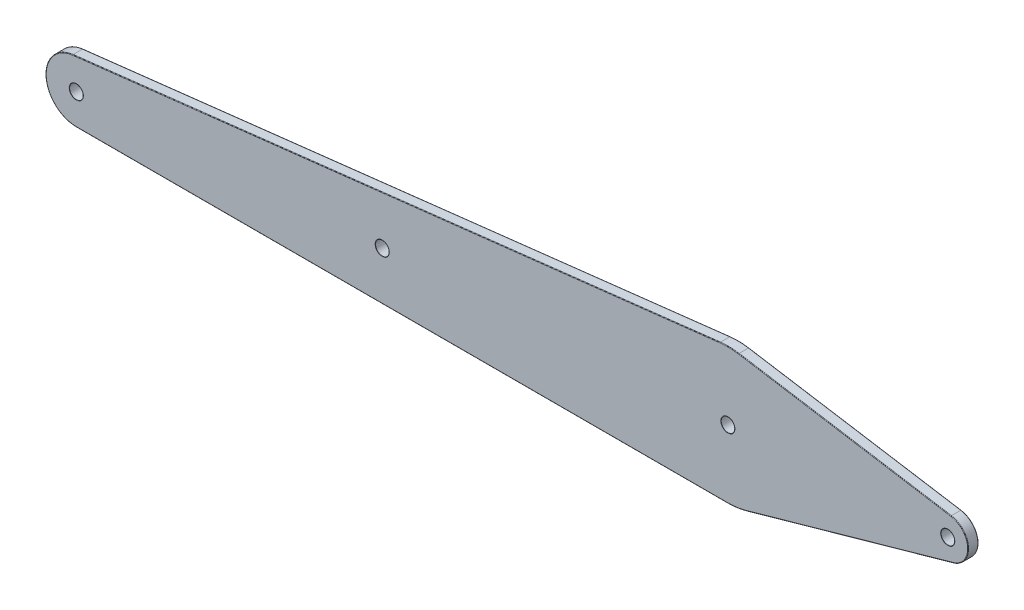
ISO-10303-21;
HEADER;
FILE_DESCRIPTION(('STEP AP214'),'2;1');
FILE_NAME('part.step','',(''),(''),'','','');
FILE_SCHEMA(('AUTOMOTIVE_DESIGN { 1 0 10303 214 1 1 1 1 }'));
ENDSEC;
DATA;
#1=APPLICATION_CONTEXT('core data for automotive mechanical design processes');
#2=APPLICATION_PROTOCOL_DEFINITION('international standard','automotive_design',2000,#1);
#3=PRODUCT_CONTEXT('',#1,'mechanical');
#4=PRODUCT('Part','Part','',(#3));
#5=PRODUCT_RELATED_PRODUCT_CATEGORY('part','',(#4));
#6=PRODUCT_DEFINITION_FORMATION('','',#4);
#7=PRODUCT_DEFINITION_CONTEXT('part definition',#1,'design');
#8=PRODUCT_DEFINITION('design','',#6,#7);
#9=PRODUCT_DEFINITION_SHAPE('','',#8);
#10=(LENGTH_UNIT() NAMED_UNIT(*) SI_UNIT(.MILLI.,.METRE.));
#11=(NAMED_UNIT(*) PLANE_ANGLE_UNIT() SI_UNIT($,.RADIAN.));
#12=(NAMED_UNIT(*) SI_UNIT($,.STERADIAN.) SOLID_ANGLE_UNIT());
#13=UNCERTAINTY_MEASURE_WITH_UNIT(LENGTH_MEASURE(1.E-05),#10,'distance_accuracy_value','');
#14=(GEOMETRIC_REPRESENTATION_CONTEXT(3) GLOBAL_UNCERTAINTY_ASSIGNED_CONTEXT((#13)) GLOBAL_UNIT_ASSIGNED_CONTEXT((#10,
#11,#12)) REPRESENTATION_CONTEXT('',''));
#15=CARTESIAN_POINT('',(0.,0.,0.));
#16=DIRECTION('',(0.,0.,1.));
#17=DIRECTION('',(1.,0.,0.));
#18=AXIS2_PLACEMENT_3D('',#15,#16,#17);
#19=CARTESIAN_POINT('',(-20.4156966855308,205.579870617494,-3.));
#20=DIRECTION('',(0.,0.,1.));
#21=DIRECTION('',(1.,0.,0.));
#22=AXIS2_PLACEMENT_3D('',#19,#20,#21);
#23=CYLINDRICAL_SURFACE('',#22,19.9999999999999);
#24=DIRECTION('',(0.,0.,1.));
#25=VECTOR('',#24,1.);
#26=CARTESIAN_POINT('',(-14.9830347816257,186.331852936759,-3.));
#27=LINE('',#26,#25);
#28=CARTESIAN_POINT('',(-14.9830347816257,186.331852936759,-2.85));
#29=VERTEX_POINT('',#28);
#30=CARTESIAN_POINT('',(-14.9830347816257,186.331852936759,-0.15));
#31=VERTEX_POINT('',#30);
#32=EDGE_CURVE('E253',#29,#31,#27,.T.);
#33=ORIENTED_EDGE('',*,*,#32,.T.);
#34=CARTESIAN_POINT('',(-20.4156966855308,205.579870617494,-0.15));
#35=DIRECTION('',(0.,0.,1.));
#36=DIRECTION('',(1.,0.,0.));
#37=AXIS2_PLACEMENT_3D('',#34,#35,#36);
#38=CIRCLE('',#37,19.9999999999999);
#39=CARTESIAN_POINT('',(-20.4156966855308,185.579870617494,-0.15));
#40=VERTEX_POINT('',#39);
#41=EDGE_CURVE('E210',#31,#40,#38,.F.);
#42=ORIENTED_EDGE('',*,*,#41,.T.);
#43=DIRECTION('',(0.,0.,1.));
#44=VECTOR('',#43,1.);
#45=CARTESIAN_POINT('',(-20.4156966855308,185.579870617494,-3.));
#46=LINE('',#45,#44);
#47=CARTESIAN_POINT('',(-20.4156966855308,185.579870617494,-2.85));
#48=VERTEX_POINT('',#47);
#49=EDGE_CURVE('E300',#48,#40,#46,.T.);
#50=ORIENTED_EDGE('',*,*,#49,.F.);
#51=CARTESIAN_POINT('',(-20.4156966855308,205.579870617494,-2.85));
#52=DIRECTION('',(0.,0.,1.));
#53=DIRECTION('',(1.,0.,0.));
#54=AXIS2_PLACEMENT_3D('',#51,#52,#53);
#55=CIRCLE('',#54,19.9999999999999);
#56=EDGE_CURVE('E208',#48,#29,#55,.T.);
#57=ORIENTED_EDGE('',*,*,#56,.T.);
#58=EDGE_LOOP('',(#33,#42,#50,#57));
#59=FACE_BOUND('',#58,.T.);
#60=ADVANCED_FACE('F34',(#59),#23,.T.);
#61=CARTESIAN_POINT('',(-212.100333524272,185.579870617494,-3.));
#62=DIRECTION('',(0.,-1.,0.));
#63=DIRECTION('',(1.,0.,0.));
#64=AXIS2_PLACEMENT_3D('',#61,#62,#63);
#65=PLANE('',#64);
#66=ORIENTED_EDGE('',*,*,#49,.T.);
#67=DIRECTION('',(1.,0.,0.));
#68=VECTOR('',#67,1.);
#69=CARTESIAN_POINT('',(-212.100333524272,185.579870617494,-0.15));
#70=LINE('',#69,#68);
#71=CARTESIAN_POINT('',(-212.100333524272,185.579870617494,-0.15));
#72=VERTEX_POINT('',#71);
#73=EDGE_CURVE('E154',#40,#72,#70,.F.);
#74=ORIENTED_EDGE('',*,*,#73,.T.);
#75=DIRECTION('',(0.,0.,1.));
#76=VECTOR('',#75,1.);
#77=CARTESIAN_POINT('',(-212.100333524272,185.579870617494,-3.));
#78=LINE('',#77,#76);
#79=CARTESIAN_POINT('',(-212.100333524272,185.579870617494,-2.85));
#80=VERTEX_POINT('',#79);
#81=EDGE_CURVE('E304',#80,#72,#78,.T.);
#82=ORIENTED_EDGE('',*,*,#81,.F.);
#83=DIRECTION('',(1.,0.,0.));
#84=VECTOR('',#83,1.);
#85=CARTESIAN_POINT('',(-20.4156966855308,185.579870617494,-2.85));
#86=LINE('',#85,#84);
#87=EDGE_CURVE('E175',#80,#48,#86,.T.);
#88=ORIENTED_EDGE('',*,*,#87,.T.);
#89=EDGE_LOOP('',(#66,#74,#82,#88));
#90=FACE_BOUND('',#89,.T.);
#91=ADVANCED_FACE('F354',(#90),#65,.T.);
#92=CARTESIAN_POINT('',(-212.100333524272,194.579870617494,-3.));
#93=DIRECTION('',(0.,0.,1.));
#94=DIRECTION('',(1.,0.,0.));
#95=AXIS2_PLACEMENT_3D('',#92,#93,#94);
#96=CYLINDRICAL_SURFACE('',#95,8.99999999999999);
#97=ORIENTED_EDGE('',*,*,#81,.T.);
#98=CARTESIAN_POINT('',(-212.100333524272,194.579870617494,-0.15));
#99=DIRECTION('',(0.,0.,1.));
#100=DIRECTION('',(1.,0.,0.));
#101=AXIS2_PLACEMENT_3D('',#98,#99,#100);
#102=CIRCLE('',#101,8.99999999999999);
#103=CARTESIAN_POINT('',(-213.129889679167,203.520788586244,-0.15));
#104=VERTEX_POINT('',#103);
#105=EDGE_CURVE('E185',#72,#104,#102,.F.);
#106=ORIENTED_EDGE('',*,*,#105,.T.);
#107=DIRECTION('',(0.,0.,1.));
#108=VECTOR('',#107,1.);
#109=CARTESIAN_POINT('',(-213.129889679167,203.520788586244,-3.));
#110=LINE('',#109,#108);
#111=CARTESIAN_POINT('',(-213.129889679167,203.520788586244,-2.85));
#112=VERTEX_POINT('',#111);
#113=EDGE_CURVE('E307',#112,#104,#110,.T.);
#114=ORIENTED_EDGE('',*,*,#113,.F.);
#115=CARTESIAN_POINT('',(-212.100333524272,194.579870617494,-2.85));
#116=DIRECTION('',(0.,0.,1.));
#117=DIRECTION('',(1.,0.,0.));
#118=AXIS2_PLACEMENT_3D('',#115,#116,#117);
#119=CIRCLE('',#118,8.99999999999999);
#120=EDGE_CURVE('E183',#112,#80,#119,.T.);
#121=ORIENTED_EDGE('',*,*,#120,.T.);
#122=EDGE_LOOP('',(#97,#106,#114,#121));
#123=FACE_BOUND('',#122,.T.);
#124=ADVANCED_FACE('F357',(#123),#96,.T.);
#125=CARTESIAN_POINT('',(-213.129889679167,203.520788586244,-3.));
#126=DIRECTION('',(-0.114395128321731,0.993435329861111,0.));
#127=DIRECTION('',(-0.993435329861111,-0.114395128321731,0.));
#128=AXIS2_PLACEMENT_3D('',#125,#126,#127);
#129=PLANE('',#128);
#130=ORIENTED_EDGE('',*,*,#113,.T.);
#131=DIRECTION('',(-0.993435329861111,-0.114395128321731,0.));
#132=VECTOR('',#131,1.);
#133=CARTESIAN_POINT('',(-213.129889679167,203.520788586244,-0.15));
#134=LINE('',#133,#132);
#135=CARTESIAN_POINT('',(-22.7035992519654,225.448577214716,-0.15));
#136=VERTEX_POINT('',#135);
#137=EDGE_CURVE('E189',#104,#136,#134,.F.);
#138=ORIENTED_EDGE('',*,*,#137,.T.);
#139=DIRECTION('',(0.,0.,1.));
#140=VECTOR('',#139,1.);
#141=CARTESIAN_POINT('',(-22.7035992519654,225.448577214716,-3.));
#142=LINE('',#141,#140);
#143=CARTESIAN_POINT('',(-22.7035992519654,225.448577214716,-2.85));
#144=VERTEX_POINT('',#143);
#145=EDGE_CURVE('E310',#144,#136,#142,.T.);
#146=ORIENTED_EDGE('',*,*,#145,.F.);
#147=DIRECTION('',(-0.993435329861111,-0.114395128321731,0.));
#148=VECTOR('',#147,1.);
#149=CARTESIAN_POINT('',(-213.129889679167,203.520788586244,-2.85));
#150=LINE('',#149,#148);
#151=EDGE_CURVE('E187',#144,#112,#150,.T.);
#152=ORIENTED_EDGE('',*,*,#151,.T.);
#153=EDGE_LOOP('',(#130,#138,#146,#152));
#154=FACE_BOUND('',#153,.T.);
#155=ADVANCED_FACE('F511',(#154),#129,.T.);
#156=CARTESIAN_POINT('',(-20.4156966855308,205.579870617494,-3.));
#157=DIRECTION('',(0.,0.,1.));
#158=DIRECTION('',(1.,0.,0.));
#159=AXIS2_PLACEMENT_3D('',#156,#157,#158);
#160=CYLINDRICAL_SURFACE('',#159,20.);
#161=ORIENTED_EDGE('',*,*,#145,.T.);
#162=CARTESIAN_POINT('',(-20.4156966855308,205.579870617494,-0.15));
#163=DIRECTION('',(0.,0.,1.));
#164=DIRECTION('',(1.,0.,0.));
#165=AXIS2_PLACEMENT_3D('',#162,#163,#164);
#166=CIRCLE('',#165,20.);
#167=CARTESIAN_POINT('',(-17.2205778675275,225.323001466952,-0.15));
#168=VERTEX_POINT('',#167);
#169=EDGE_CURVE('E193',#136,#168,#166,.F.);
#170=ORIENTED_EDGE('',*,*,#169,.T.);
#171=DIRECTION('',(0.,0.,1.));
#172=VECTOR('',#171,1.);
#173=CARTESIAN_POINT('',(-17.2205778675275,225.323001466952,-3.));
#174=LINE('',#173,#172);
#175=CARTESIAN_POINT('',(-17.2205778675275,225.323001466952,-2.85));
#176=VERTEX_POINT('',#175);
#177=EDGE_CURVE('E313',#176,#168,#174,.T.);
#178=ORIENTED_EDGE('',*,*,#177,.F.);
#179=CARTESIAN_POINT('',(-20.4156966855308,205.579870617494,-2.85));
#180=DIRECTION('',(0.,0.,1.));
#181=DIRECTION('',(1.,0.,0.));
#182=AXIS2_PLACEMENT_3D('',#179,#180,#181);
#183=CIRCLE('',#182,20.);
#184=EDGE_CURVE('E191',#176,#144,#183,.T.);
#185=ORIENTED_EDGE('',*,*,#184,.T.);
#186=EDGE_LOOP('',(#161,#170,#178,#185));
#187=FACE_BOUND('',#186,.T.);
#188=ADVANCED_FACE('F392',(#187),#160,.T.);
#189=CARTESIAN_POINT('',(-17.2205778675275,225.323001466952,-3.));
#190=DIRECTION('',(0.159755940900164,0.987156542472927,0.));
#191=DIRECTION('',(-0.987156542472927,0.159755940900164,0.));
#192=AXIS2_PLACEMENT_3D('',#189,#190,#191);
#193=PLANE('',#192);
#194=ORIENTED_EDGE('',*,*,#177,.T.);
#195=DIRECTION('',(-0.987156542472927,0.159755940900164,0.));
#196=VECTOR('',#195,1.);
#197=CARTESIAN_POINT('',(-17.2205778675275,225.323001466952,-0.15));
#198=LINE('',#197,#196);
#199=CARTESIAN_POINT('',(45.2364038929452,215.215309872331,-0.15));
#200=VERTEX_POINT('',#199);
#201=EDGE_CURVE('E197',#168,#200,#198,.F.);
#202=ORIENTED_EDGE('',*,*,#201,.T.);
#203=DIRECTION('',(0.,0.,1.));
#204=VECTOR('',#203,1.);
#205=CARTESIAN_POINT('',(45.2364038929452,215.215309872331,-3.));
#206=LINE('',#205,#204);
#207=CARTESIAN_POINT('',(45.2364038929452,215.215309872331,-2.85));
#208=VERTEX_POINT('',#207);
#209=EDGE_CURVE('E316',#208,#200,#206,.T.);
#210=ORIENTED_EDGE('',*,*,#209,.F.);
#211=DIRECTION('',(-0.987156542472927,0.159755940900164,0.));
#212=VECTOR('',#211,1.);
#213=CARTESIAN_POINT('',(-17.2205778675275,225.323001466952,-2.85));
#214=LINE('',#213,#212);
#215=EDGE_CURVE('E195',#208,#176,#214,.T.);
#216=ORIENTED_EDGE('',*,*,#215,.T.);
#217=EDGE_LOOP('',(#194,#202,#210,#216));
#218=FACE_BOUND('',#217,.T.);
#219=ADVANCED_FACE('F396',(#218),#193,.T.);
#220=CARTESIAN_POINT('',(44.2778682475443,209.292370617494,-3.));
#221=DIRECTION('',(0.,0.,1.));
#222=DIRECTION('',(1.,0.,0.));
#223=AXIS2_PLACEMENT_3D('',#220,#221,#222);
#224=CYLINDRICAL_SURFACE('',#223,5.99999999999993);
#225=ORIENTED_EDGE('',*,*,#209,.T.);
#226=CARTESIAN_POINT('',(44.2778682475443,209.292370617494,-0.15));
#227=DIRECTION('',(0.,0.,1.));
#228=DIRECTION('',(1.,0.,0.));
#229=AXIS2_PLACEMENT_3D('',#226,#227,#228);
#230=CIRCLE('',#229,5.99999999999993);
#231=CARTESIAN_POINT('',(45.9076668187158,203.517965313273,-0.15));
#232=VERTEX_POINT('',#231);
#233=EDGE_CURVE('E201',#200,#232,#230,.F.);
#234=ORIENTED_EDGE('',*,*,#233,.T.);
#235=DIRECTION('',(0.,0.,1.));
#236=VECTOR('',#235,1.);
#237=CARTESIAN_POINT('',(45.9076668187158,203.517965313273,-3.));
#238=LINE('',#237,#236);
#239=CARTESIAN_POINT('',(45.9076668187158,203.517965313273,-2.85));
#240=VERTEX_POINT('',#239);
#241=EDGE_CURVE('E319',#240,#232,#238,.T.);
#242=ORIENTED_EDGE('',*,*,#241,.F.);
#243=CARTESIAN_POINT('',(44.2778682475443,209.292370617494,-2.85));
#244=DIRECTION('',(0.,0.,1.));
#245=DIRECTION('',(1.,0.,0.));
#246=AXIS2_PLACEMENT_3D('',#243,#244,#245);
#247=CIRCLE('',#246,5.99999999999993);
#248=EDGE_CURVE('E199',#240,#208,#247,.T.);
#249=ORIENTED_EDGE('',*,*,#248,.T.);
#250=EDGE_LOOP('',(#225,#234,#242,#249));
#251=FACE_BOUND('',#250,.T.);
#252=ADVANCED_FACE('F505',(#251),#224,.T.);
#253=CARTESIAN_POINT('',(-14.9830347816257,186.331852936759,-3.));
#254=DIRECTION('',(0.271633095195253,-0.962400884036713,0.));
#255=DIRECTION('',(0.962400884036713,0.271633095195253,0.));
#256=AXIS2_PLACEMENT_3D('',#253,#254,#255);
#257=PLANE('',#256);
#258=ORIENTED_EDGE('',*,*,#241,.T.);
#259=DIRECTION('',(0.962400884036713,0.271633095195253,0.));
#260=VECTOR('',#259,1.);
#261=CARTESIAN_POINT('',(-14.9830347816257,186.331852936759,-0.15));
#262=LINE('',#261,#260);
#263=EDGE_CURVE('E206',#232,#31,#262,.F.);
#264=ORIENTED_EDGE('',*,*,#263,.T.);
#265=ORIENTED_EDGE('',*,*,#32,.F.);
#266=DIRECTION('',(0.962400884036713,0.271633095195253,0.));
#267=VECTOR('',#266,1.);
#268=CARTESIAN_POINT('',(45.9076668187158,203.517965313273,-2.85));
#269=LINE('',#268,#267);
#270=EDGE_CURVE('E203',#29,#240,#269,.T.);
#271=ORIENTED_EDGE('',*,*,#270,.T.);
#272=EDGE_LOOP('',(#258,#264,#265,#271));
#273=FACE_BOUND('',#272,.T.);
#274=ADVANCED_FACE('F430',(#273),#257,.T.);
#275=CARTESIAN_POINT('',(-20.4156966855308,205.579870617494,-3.));
#276=DIRECTION('',(0.,0.,1.));
#277=DIRECTION('',(1.,0.,0.));
#278=AXIS2_PLACEMENT_3D('',#275,#276,#277);
#279=PLANE('',#278);
#280=CARTESIAN_POINT('',(44.2778682475443,209.292370617494,-3.));
#281=DIRECTION('',(0.,0.,1.));
#282=DIRECTION('',(1.,0.,0.));
#283=AXIS2_PLACEMENT_3D('',#280,#281,#282);
#284=CIRCLE('',#283,5.84999999999993);
#285=CARTESIAN_POINT('',(45.2124405018102,215.06723639096,-3.));
#286=VERTEX_POINT('',#285);
#287=CARTESIAN_POINT('',(45.8669218544365,203.662325445879,-3.));
#288=VERTEX_POINT('',#287);
#289=EDGE_CURVE('E43',#286,#288,#284,.F.);
#290=ORIENTED_EDGE('',*,*,#289,.T.);
#291=DIRECTION('',(0.962400884036713,0.271633095195253,0.));
#292=VECTOR('',#291,1.);
#293=CARTESIAN_POINT('',(-15.023779745905,186.476213069365,-3.));
#294=LINE('',#293,#292);
#295=CARTESIAN_POINT('',(-15.023779745905,186.476213069365,-3.));
#296=VERTEX_POINT('',#295);
#297=EDGE_CURVE('E11',#288,#296,#294,.F.);
#298=ORIENTED_EDGE('',*,*,#297,.T.);
#299=CARTESIAN_POINT('',(-20.4156966855308,205.579870617494,-3.));
#300=DIRECTION('',(0.,0.,1.));
#301=DIRECTION('',(1.,0.,0.));
#302=AXIS2_PLACEMENT_3D('',#299,#300,#301);
#303=CIRCLE('',#302,19.8499999999999);
#304=CARTESIAN_POINT('',(-20.4156966855308,185.729870617494,-3.));
#305=VERTEX_POINT('',#304);
#306=EDGE_CURVE('E224',#296,#305,#303,.F.);
#307=ORIENTED_EDGE('',*,*,#306,.T.);
#308=DIRECTION('',(1.,0.,0.));
#309=VECTOR('',#308,1.);
#310=CARTESIAN_POINT('',(-212.100333524272,185.729870617494,-3.));
#311=LINE('',#310,#309);
#312=CARTESIAN_POINT('',(-212.100333524272,185.729870617494,-3.));
#313=VERTEX_POINT('',#312);
#314=EDGE_CURVE('E226',#305,#313,#311,.F.);
#315=ORIENTED_EDGE('',*,*,#314,.T.);
#316=CARTESIAN_POINT('',(-212.100333524272,194.579870617494,-3.));
#317=DIRECTION('',(0.,0.,1.));
#318=DIRECTION('',(1.,0.,0.));
#319=AXIS2_PLACEMENT_3D('',#316,#317,#318);
#320=CIRCLE('',#319,8.84999999999999);
#321=CARTESIAN_POINT('',(-213.112730409919,203.371773286764,-3.));
#322=VERTEX_POINT('',#321);
#323=EDGE_CURVE('E228',#313,#322,#320,.F.);
#324=ORIENTED_EDGE('',*,*,#323,.T.);
#325=DIRECTION('',(-0.993435329861111,-0.114395128321731,0.));
#326=VECTOR('',#325,1.);
#327=CARTESIAN_POINT('',(-22.6864399827171,225.299561915237,-3.));
#328=LINE('',#327,#326);
#329=CARTESIAN_POINT('',(-22.6864399827172,225.299561915237,-3.));
#330=VERTEX_POINT('',#329);
#331=EDGE_CURVE('E230',#322,#330,#328,.F.);
#332=ORIENTED_EDGE('',*,*,#331,.T.);
#333=CARTESIAN_POINT('',(-20.4156966855308,205.579870617494,-3.));
#334=DIRECTION('',(0.,0.,1.));
#335=DIRECTION('',(1.,0.,0.));
#336=AXIS2_PLACEMENT_3D('',#333,#334,#335);
#337=CIRCLE('',#336,19.85);
#338=CARTESIAN_POINT('',(-17.2445412586625,225.174927985581,-3.));
#339=VERTEX_POINT('',#338);
#340=EDGE_CURVE('E232',#330,#339,#337,.F.);
#341=ORIENTED_EDGE('',*,*,#340,.T.);
#342=DIRECTION('',(-0.987156542472927,0.159755940900164,0.));
#343=VECTOR('',#342,1.);
#344=CARTESIAN_POINT('',(45.2124405018102,215.06723639096,-3.));
#345=LINE('',#344,#343);
#346=EDGE_CURVE('E54',#339,#286,#345,.F.);
#347=ORIENTED_EDGE('',*,*,#346,.T.);
#348=EDGE_LOOP('',(#290,#298,#307,#315,#324,#332,#341,#347));
#349=FACE_BOUND('',#348,.T.);
#350=CARTESIAN_POINT('',(-212.100333524272,194.579870617494,-3.));
#351=DIRECTION('',(0.,0.,1.));
#352=DIRECTION('',(1.,0.,0.));
#353=AXIS2_PLACEMENT_3D('',#350,#351,#352);
#354=CIRCLE('',#353,2.09999999999998);
#355=CARTESIAN_POINT('',(-210.000333524272,194.579870617494,-3.));
#356=VERTEX_POINT('',#355);
#357=EDGE_CURVE('E221',#356,#356,#354,.T.);
#358=ORIENTED_EDGE('',*,*,#357,.T.);
#359=EDGE_LOOP('',(#358));
#360=FACE_BOUND('',#359,.T.);
#361=CARTESIAN_POINT('',(-122.100333524272,199.744603776744,-3.));
#362=DIRECTION('',(0.,0.,1.));
#363=DIRECTION('',(1.,0.,0.));
#364=AXIS2_PLACEMENT_3D('',#361,#362,#363);
#365=CIRCLE('',#364,2.09999999999999);
#366=CARTESIAN_POINT('',(-120.000333524272,199.744603776744,-3.));
#367=VERTEX_POINT('',#366);
#368=EDGE_CURVE('E218',#367,#367,#365,.T.);
#369=ORIENTED_EDGE('',*,*,#368,.T.);
#370=EDGE_LOOP('',(#369));
#371=FACE_BOUND('',#370,.T.);
#372=CARTESIAN_POINT('',(-20.4156966855308,205.579870617494,-3.));
#373=DIRECTION('',(0.,0.,1.));
#374=DIRECTION('',(1.,0.,0.));
#375=AXIS2_PLACEMENT_3D('',#372,#373,#374);
#376=CIRCLE('',#375,2.09999999999999);
#377=CARTESIAN_POINT('',(-18.3156966855308,205.579870617494,-3.));
#378=VERTEX_POINT('',#377);
#379=EDGE_CURVE('E215',#378,#378,#376,.T.);
#380=ORIENTED_EDGE('',*,*,#379,.T.);
#381=EDGE_LOOP('',(#380));
#382=FACE_BOUND('',#381,.T.);
#383=CARTESIAN_POINT('',(44.2778682475443,209.292370617494,-3.));
#384=DIRECTION('',(0.,0.,1.));
#385=DIRECTION('',(1.,0.,0.));
#386=AXIS2_PLACEMENT_3D('',#383,#384,#385);
#387=CIRCLE('',#386,2.09999999999999);
#388=CARTESIAN_POINT('',(46.3778682475443,209.292370617494,-3.));
#389=VERTEX_POINT('',#388);
#390=EDGE_CURVE('E212',#389,#389,#387,.T.);
#391=ORIENTED_EDGE('',*,*,#390,.T.);
#392=EDGE_LOOP('',(#391));
#393=FACE_BOUND('',#392,.T.);
#394=ADVANCED_FACE('F410',(#349,#360,#371,#382,#393),#279,.F.);
#395=CARTESIAN_POINT('',(-20.4156966855308,205.579870617494,0.));
#396=DIRECTION('',(0.,0.,1.));
#397=DIRECTION('',(1.,0.,0.));
#398=AXIS2_PLACEMENT_3D('',#395,#396,#397);
#399=PLANE('',#398);
#400=CARTESIAN_POINT('',(-212.100333524272,194.579870617494,0.));
#401=DIRECTION('',(0.,0.,1.));
#402=DIRECTION('',(1.,0.,0.));
#403=AXIS2_PLACEMENT_3D('',#400,#401,#402);
#404=CIRCLE('',#403,8.84999999999999);
#405=CARTESIAN_POINT('',(-213.112730409919,203.371773286764,0.));
#406=VERTEX_POINT('',#405);
#407=CARTESIAN_POINT('',(-212.100333524272,185.729870617494,0.));
#408=VERTEX_POINT('',#407);
#409=EDGE_CURVE('E173',#406,#408,#404,.T.);
#410=ORIENTED_EDGE('',*,*,#409,.T.);
#411=DIRECTION('',(1.,0.,0.));
#412=VECTOR('',#411,1.);
#413=CARTESIAN_POINT('',(-20.4156966855308,185.729870617494,0.));
#414=LINE('',#413,#412);
#415=CARTESIAN_POINT('',(-20.4156966855308,185.729870617494,0.));
#416=VERTEX_POINT('',#415);
#417=EDGE_CURVE('E152',#408,#416,#414,.T.);
#418=ORIENTED_EDGE('',*,*,#417,.T.);
#419=CARTESIAN_POINT('',(-20.4156966855308,205.579870617494,0.));
#420=DIRECTION('',(0.,0.,1.));
#421=DIRECTION('',(1.,0.,0.));
#422=AXIS2_PLACEMENT_3D('',#419,#420,#421);
#423=CIRCLE('',#422,19.8499999999999);
#424=CARTESIAN_POINT('',(-15.023779745905,186.476213069365,0.));
#425=VERTEX_POINT('',#424);
#426=EDGE_CURVE('E161',#416,#425,#423,.T.);
#427=ORIENTED_EDGE('',*,*,#426,.T.);
#428=DIRECTION('',(0.962400884036713,0.271633095195253,0.));
#429=VECTOR('',#428,1.);
#430=CARTESIAN_POINT('',(-15.023779745905,186.476213069365,0.));
#431=LINE('',#430,#429);
#432=CARTESIAN_POINT('',(45.8669218544365,203.662325445879,0.));
#433=VERTEX_POINT('',#432);
#434=EDGE_CURVE('E167',#425,#433,#431,.T.);
#435=ORIENTED_EDGE('',*,*,#434,.T.);
#436=CARTESIAN_POINT('',(44.2778682475443,209.292370617494,0.));
#437=DIRECTION('',(0.,0.,1.));
#438=DIRECTION('',(1.,0.,0.));
#439=AXIS2_PLACEMENT_3D('',#436,#437,#438);
#440=CIRCLE('',#439,5.84999999999993);
#441=CARTESIAN_POINT('',(45.2124405018102,215.06723639096,0.));
#442=VERTEX_POINT('',#441);
#443=EDGE_CURVE('E335',#433,#442,#440,.T.);
#444=ORIENTED_EDGE('',*,*,#443,.T.);
#445=DIRECTION('',(-0.987156542472927,0.159755940900164,0.));
#446=VECTOR('',#445,1.);
#447=CARTESIAN_POINT('',(-17.2445412586625,225.174927985581,0.));
#448=LINE('',#447,#446);
#449=CARTESIAN_POINT('',(-17.2445412586625,225.174927985581,0.));
#450=VERTEX_POINT('',#449);
#451=EDGE_CURVE('E337',#442,#450,#448,.T.);
#452=ORIENTED_EDGE('',*,*,#451,.T.);
#453=CARTESIAN_POINT('',(-20.4156966855308,205.579870617494,0.));
#454=DIRECTION('',(0.,0.,1.));
#455=DIRECTION('',(1.,0.,0.));
#456=AXIS2_PLACEMENT_3D('',#453,#454,#455);
#457=CIRCLE('',#456,19.85);
#458=CARTESIAN_POINT('',(-22.6864399827171,225.299561915237,0.));
#459=VERTEX_POINT('',#458);
#460=EDGE_CURVE('E339',#450,#459,#457,.T.);
#461=ORIENTED_EDGE('',*,*,#460,.T.);
#462=DIRECTION('',(-0.993435329861111,-0.114395128321731,0.));
#463=VECTOR('',#462,1.);
#464=CARTESIAN_POINT('',(-22.6864399827172,225.299561915237,0.));
#465=LINE('',#464,#463);
#466=EDGE_CURVE('E178',#459,#406,#465,.T.);
#467=ORIENTED_EDGE('',*,*,#466,.T.);
#468=EDGE_LOOP('',(#410,#418,#427,#435,#444,#452,#461,#467));
#469=FACE_BOUND('',#468,.T.);
#470=CARTESIAN_POINT('',(-212.100333524272,194.579870617494,0.));
#471=DIRECTION('',(0.,0.,1.));
#472=DIRECTION('',(1.,0.,0.));
#473=AXIS2_PLACEMENT_3D('',#470,#471,#472);
#474=CIRCLE('',#473,2.09999999999998);
#475=CARTESIAN_POINT('',(-210.000333524272,194.579870617494,0.));
#476=VERTEX_POINT('',#475);
#477=EDGE_CURVE('E168',#476,#476,#474,.F.);
#478=ORIENTED_EDGE('',*,*,#477,.T.);
#479=EDGE_LOOP('',(#478));
#480=FACE_BOUND('',#479,.T.);
#481=CARTESIAN_POINT('',(-122.100333524272,199.744603776744,0.));
#482=DIRECTION('',(0.,0.,1.));
#483=DIRECTION('',(1.,0.,0.));
#484=AXIS2_PLACEMENT_3D('',#481,#482,#483);
#485=CIRCLE('',#484,2.09999999999999);
#486=CARTESIAN_POINT('',(-120.000333524272,199.744603776744,0.));
#487=VERTEX_POINT('',#486);
#488=EDGE_CURVE('E329',#487,#487,#485,.F.);
#489=ORIENTED_EDGE('',*,*,#488,.T.);
#490=EDGE_LOOP('',(#489));
#491=FACE_BOUND('',#490,.T.);
#492=CARTESIAN_POINT('',(-20.4156966855308,205.579870617494,0.));
#493=DIRECTION('',(0.,0.,1.));
#494=DIRECTION('',(1.,0.,0.));
#495=AXIS2_PLACEMENT_3D('',#492,#493,#494);
#496=CIRCLE('',#495,2.09999999999999);
#497=CARTESIAN_POINT('',(-18.3156966855308,205.579870617494,0.));
#498=VERTEX_POINT('',#497);
#499=EDGE_CURVE('E326',#498,#498,#496,.F.);
#500=ORIENTED_EDGE('',*,*,#499,.T.);
#501=EDGE_LOOP('',(#500));
#502=FACE_BOUND('',#501,.T.);
#503=CARTESIAN_POINT('',(44.2778682475443,209.292370617494,0.));
#504=DIRECTION('',(0.,0.,1.));
#505=DIRECTION('',(1.,0.,0.));
#506=AXIS2_PLACEMENT_3D('',#503,#504,#505);
#507=CIRCLE('',#506,2.09999999999999);
#508=CARTESIAN_POINT('',(46.3778682475443,209.292370617494,0.));
#509=VERTEX_POINT('',#508);
#510=EDGE_CURVE('E303',#509,#509,#507,.F.);
#511=ORIENTED_EDGE('',*,*,#510,.T.);
#512=EDGE_LOOP('',(#511));
#513=FACE_BOUND('',#512,.T.);
#514=ADVANCED_FACE('F170',(#469,#480,#491,#502,#513),#399,.T.);
#515=CARTESIAN_POINT('',(-17.2445412586625,225.174927985581,-0.15));
#516=DIRECTION('',(-0.987156542472927,0.159755940900164,0.));
#517=DIRECTION('',(-0.159755940900164,-0.987156542472927,0.));
#518=AXIS2_PLACEMENT_3D('',#515,#516,#517);
#519=CYLINDRICAL_SURFACE('',#518,0.15);
#520=CARTESIAN_POINT('',(45.2124405018102,215.06723639096,-0.15));
#521=DIRECTION('',(0.98715654247293,-0.159755940900145,0.));
#522=DIRECTION('',(0.159755940900145,0.98715654247293,0.));
#523=AXIS2_PLACEMENT_3D('',#520,#521,#522);
#524=CIRCLE('',#523,0.15);
#525=EDGE_CURVE('E247',#200,#442,#524,.T.);
#526=ORIENTED_EDGE('',*,*,#525,.F.);
#527=ORIENTED_EDGE('',*,*,#201,.F.);
#528=CARTESIAN_POINT('',(-17.2445412586625,225.174927985581,-0.15));
#529=DIRECTION('',(-0.987156542472926,0.159755940900167,0.));
#530=DIRECTION('',(-0.159755940900167,-0.987156542472926,0.));
#531=AXIS2_PLACEMENT_3D('',#528,#529,#530);
#532=CIRCLE('',#531,0.15);
#533=EDGE_CURVE('E250',#450,#168,#532,.T.);
#534=ORIENTED_EDGE('',*,*,#533,.F.);
#535=ORIENTED_EDGE('',*,*,#451,.F.);
#536=EDGE_LOOP('',(#526,#527,#534,#535));
#537=FACE_BOUND('',#536,.T.);
#538=ADVANCED_FACE('F385',(#537),#519,.T.);
#539=CARTESIAN_POINT('',(-20.4156966855308,205.579870617494,-0.15));
#540=DIRECTION('',(0.,0.,1.));
#541=DIRECTION('',(1.,0.,0.));
#542=AXIS2_PLACEMENT_3D('',#539,#540,#541);
#543=TOROIDAL_SURFACE('',#542,19.85,0.15);
#544=ORIENTED_EDGE('',*,*,#533,.T.);
#545=ORIENTED_EDGE('',*,*,#169,.F.);
#546=CARTESIAN_POINT('',(-22.6864399827171,225.299561915237,-0.15));
#547=DIRECTION('',(-0.993435329861112,-0.114395128321723,0.));
#548=DIRECTION('',(0.114395128321723,-0.993435329861112,0.));
#549=AXIS2_PLACEMENT_3D('',#546,#547,#548);
#550=CIRCLE('',#549,0.15);
#551=EDGE_CURVE('E244',#459,#136,#550,.T.);
#552=ORIENTED_EDGE('',*,*,#551,.F.);
#553=ORIENTED_EDGE('',*,*,#460,.F.);
#554=EDGE_LOOP('',(#544,#545,#552,#553));
#555=FACE_BOUND('',#554,.T.);
#556=ADVANCED_FACE('F389',(#555),#543,.T.);
#557=CARTESIAN_POINT('',(44.2778682475443,209.292370617494,-0.15));
#558=DIRECTION('',(0.,0.,1.));
#559=DIRECTION('',(1.,0.,0.));
#560=AXIS2_PLACEMENT_3D('',#557,#558,#559);
#561=TOROIDAL_SURFACE('',#560,5.84999999999993,0.15);
#562=ORIENTED_EDGE('',*,*,#525,.T.);
#563=ORIENTED_EDGE('',*,*,#443,.F.);
#564=CARTESIAN_POINT('',(45.8669218544365,203.662325445879,-0.15));
#565=DIRECTION('',(-0.962400884036715,-0.271633095195247,0.));
#566=DIRECTION('',(0.271633095195247,-0.962400884036715,0.));
#567=AXIS2_PLACEMENT_3D('',#564,#565,#566);
#568=CIRCLE('',#567,0.15);
#569=EDGE_CURVE('E241',#232,#433,#568,.T.);
#570=ORIENTED_EDGE('',*,*,#569,.F.);
#571=ORIENTED_EDGE('',*,*,#233,.F.);
#572=EDGE_LOOP('',(#562,#563,#570,#571));
#573=FACE_BOUND('',#572,.T.);
#574=ADVANCED_FACE('F380',(#573),#561,.T.);
#575=CARTESIAN_POINT('',(-22.6864399827172,225.299561915237,-0.15));
#576=DIRECTION('',(-0.993435329861111,-0.114395128321731,0.));
#577=DIRECTION('',(0.114395128321731,-0.993435329861111,0.));
#578=AXIS2_PLACEMENT_3D('',#575,#576,#577);
#579=CYLINDRICAL_SURFACE('',#578,0.15);
#580=ORIENTED_EDGE('',*,*,#551,.T.);
#581=ORIENTED_EDGE('',*,*,#137,.F.);
#582=CARTESIAN_POINT('',(-213.112730409919,203.371773286764,-0.15));
#583=DIRECTION('',(-0.993435329861117,-0.114395128321677,0.));
#584=DIRECTION('',(0.114395128321677,-0.993435329861117,0.));
#585=AXIS2_PLACEMENT_3D('',#582,#583,#584);
#586=CIRCLE('',#585,0.15);
#587=EDGE_CURVE('E238',#406,#104,#586,.T.);
#588=ORIENTED_EDGE('',*,*,#587,.F.);
#589=ORIENTED_EDGE('',*,*,#466,.F.);
#590=EDGE_LOOP('',(#580,#581,#588,#589));
#591=FACE_BOUND('',#590,.T.);
#592=ADVANCED_FACE('F346',(#591),#579,.T.);
#593=CARTESIAN_POINT('',(-15.023779745905,186.476213069365,-0.15));
#594=DIRECTION('',(0.962400884036713,0.271633095195253,0.));
#595=DIRECTION('',(-0.271633095195253,0.962400884036713,0.));
#596=AXIS2_PLACEMENT_3D('',#593,#594,#595);
#597=CYLINDRICAL_SURFACE('',#596,0.15);
#598=ORIENTED_EDGE('',*,*,#569,.T.);
#599=ORIENTED_EDGE('',*,*,#434,.F.);
#600=CARTESIAN_POINT('',(-15.023779745905,186.476213069365,-0.15));
#601=DIRECTION('',(-0.962400884036721,-0.271633095195225,0.));
#602=DIRECTION('',(0.271633095195226,-0.962400884036721,0.));
#603=AXIS2_PLACEMENT_3D('',#600,#601,#602);
#604=CIRCLE('',#603,0.15);
#605=EDGE_CURVE('E164',#31,#425,#604,.T.);
#606=ORIENTED_EDGE('',*,*,#605,.F.);
#607=ORIENTED_EDGE('',*,*,#263,.F.);
#608=EDGE_LOOP('',(#598,#599,#606,#607));
#609=FACE_BOUND('',#608,.T.);
#610=ADVANCED_FACE('F375',(#609),#597,.T.);
#611=CARTESIAN_POINT('',(-212.100333524272,194.579870617494,-0.15));
#612=DIRECTION('',(0.,0.,1.));
#613=DIRECTION('',(1.,0.,0.));
#614=AXIS2_PLACEMENT_3D('',#611,#612,#613);
#615=TOROIDAL_SURFACE('',#614,8.84999999999999,0.15);
#616=ORIENTED_EDGE('',*,*,#587,.T.);
#617=ORIENTED_EDGE('',*,*,#105,.F.);
#618=CARTESIAN_POINT('',(-212.100333524272,185.729870617494,-0.15));
#619=DIRECTION('',(1.,0.,0.));
#620=DIRECTION('',(0.,0.,-1.));
#621=AXIS2_PLACEMENT_3D('',#618,#619,#620);
#622=CIRCLE('',#621,0.15);
#623=EDGE_CURVE('E157',#408,#72,#622,.T.);
#624=ORIENTED_EDGE('',*,*,#623,.F.);
#625=ORIENTED_EDGE('',*,*,#409,.F.);
#626=EDGE_LOOP('',(#616,#617,#624,#625));
#627=FACE_BOUND('',#626,.T.);
#628=ADVANCED_FACE('F349',(#627),#615,.T.);
#629=CARTESIAN_POINT('',(-20.4156966855308,205.579870617494,-0.15));
#630=DIRECTION('',(0.,0.,1.));
#631=DIRECTION('',(1.,0.,0.));
#632=AXIS2_PLACEMENT_3D('',#629,#630,#631);
#633=TOROIDAL_SURFACE('',#632,19.8499999999999,0.15);
#634=ORIENTED_EDGE('',*,*,#605,.T.);
#635=ORIENTED_EDGE('',*,*,#426,.F.);
#636=CARTESIAN_POINT('',(-20.4156966855308,185.729870617494,-0.15));
#637=DIRECTION('',(-1.,0.,0.));
#638=DIRECTION('',(0.,0.,1.));
#639=AXIS2_PLACEMENT_3D('',#636,#637,#638);
#640=CIRCLE('',#639,0.15);
#641=EDGE_CURVE('E148',#40,#416,#640,.T.);
#642=ORIENTED_EDGE('',*,*,#641,.F.);
#643=ORIENTED_EDGE('',*,*,#41,.F.);
#644=EDGE_LOOP('',(#634,#635,#642,#643));
#645=FACE_BOUND('',#644,.T.);
#646=ADVANCED_FACE('F162',(#645),#633,.T.);
#647=CARTESIAN_POINT('',(-20.4156966855308,185.729870617494,-0.15));
#648=DIRECTION('',(1.,0.,0.));
#649=DIRECTION('',(0.,1.,0.));
#650=AXIS2_PLACEMENT_3D('',#647,#648,#649);
#651=CYLINDRICAL_SURFACE('',#650,0.15);
#652=ORIENTED_EDGE('',*,*,#623,.T.);
#653=ORIENTED_EDGE('',*,*,#73,.F.);
#654=ORIENTED_EDGE('',*,*,#641,.T.);
#655=ORIENTED_EDGE('',*,*,#417,.F.);
#656=EDGE_LOOP('',(#652,#653,#654,#655));
#657=FACE_BOUND('',#656,.T.);
#658=ADVANCED_FACE('F150',(#657),#651,.T.);
#659=CARTESIAN_POINT('',(-212.100333524272,194.579870617494,-0.15));
#660=DIRECTION('',(0.,0.,1.));
#661=DIRECTION('',(1.,0.,0.));
#662=AXIS2_PLACEMENT_3D('',#659,#660,#661);
#663=TOROIDAL_SURFACE('',#662,2.09999999999998,0.15);
#664=CARTESIAN_POINT('',(-212.100333524272,194.579870617494,-0.0381966011249952));
#665=DIRECTION('',(0.,0.,-1.));
#666=DIRECTION('',(-1.,0.,0.));
#667=AXIS2_PLACEMENT_3D('',#664,#665,#666);
#668=CIRCLE('',#667,2.);
#669=CARTESIAN_POINT('',(-214.100333524272,194.579870617494,-0.0381966011249952));
#670=VERTEX_POINT('',#669);
#671=EDGE_CURVE('E282',#670,#670,#668,.F.);
#672=ORIENTED_EDGE('',*,*,#671,.F.);
#673=EDGE_LOOP('',(#672));
#674=FACE_BOUND('',#673,.T.);
#675=ORIENTED_EDGE('',*,*,#477,.F.);
#676=EDGE_LOOP('',(#675));
#677=FACE_BOUND('',#676,.T.);
#678=ADVANCED_FACE('F434',(#674,#677),#663,.T.);
#679=CARTESIAN_POINT('',(-122.100333524272,199.744603776744,-0.15));
#680=DIRECTION('',(0.,0.,1.));
#681=DIRECTION('',(1.,0.,0.));
#682=AXIS2_PLACEMENT_3D('',#679,#680,#681);
#683=TOROIDAL_SURFACE('',#682,2.09999999999999,0.15);
#684=CARTESIAN_POINT('',(-122.100333524272,199.744603776744,-0.0381966011250077));
#685=DIRECTION('',(0.,0.,-1.));
#686=DIRECTION('',(-1.,0.,0.));
#687=AXIS2_PLACEMENT_3D('',#684,#685,#686);
#688=CIRCLE('',#687,2.);
#689=CARTESIAN_POINT('',(-124.100333524272,199.744603776744,-0.0381966011250077));
#690=VERTEX_POINT('',#689);
#691=EDGE_CURVE('E285',#690,#690,#688,.F.);
#692=ORIENTED_EDGE('',*,*,#691,.F.);
#693=EDGE_LOOP('',(#692));
#694=FACE_BOUND('',#693,.T.);
#695=ORIENTED_EDGE('',*,*,#488,.F.);
#696=EDGE_LOOP('',(#695));
#697=FACE_BOUND('',#696,.T.);
#698=ADVANCED_FACE('F451',(#694,#697),#683,.T.);
#699=CARTESIAN_POINT('',(-20.4156966855308,205.579870617494,-0.15));
#700=DIRECTION('',(0.,0.,1.));
#701=DIRECTION('',(1.,0.,0.));
#702=AXIS2_PLACEMENT_3D('',#699,#700,#701);
#703=TOROIDAL_SURFACE('',#702,2.09999999999999,0.15);
#704=CARTESIAN_POINT('',(-20.4156966855308,205.579870617494,-0.0381966011250014));
#705=DIRECTION('',(0.,0.,-1.));
#706=DIRECTION('',(-1.,0.,0.));
#707=AXIS2_PLACEMENT_3D('',#704,#705,#706);
#708=CIRCLE('',#707,2.);
#709=CARTESIAN_POINT('',(-22.4156966855308,205.579870617494,-0.0381966011250014));
#710=VERTEX_POINT('',#709);
#711=EDGE_CURVE('E257',#710,#710,#708,.F.);
#712=ORIENTED_EDGE('',*,*,#711,.F.);
#713=EDGE_LOOP('',(#712));
#714=FACE_BOUND('',#713,.T.);
#715=ORIENTED_EDGE('',*,*,#499,.F.);
#716=EDGE_LOOP('',(#715));
#717=FACE_BOUND('',#716,.T.);
#718=ADVANCED_FACE('F455',(#714,#717),#703,.T.);
#719=CARTESIAN_POINT('',(44.2778682475443,209.292370617494,-0.15));
#720=DIRECTION('',(0.,0.,1.));
#721=DIRECTION('',(1.,0.,0.));
#722=AXIS2_PLACEMENT_3D('',#719,#720,#721);
#723=TOROIDAL_SURFACE('',#722,2.09999999999999,0.15);
#724=CARTESIAN_POINT('',(44.2778682475443,209.292370617494,-0.0381966011249983));
#725=DIRECTION('',(0.,0.,-1.));
#726=DIRECTION('',(-1.,0.,0.));
#727=AXIS2_PLACEMENT_3D('',#724,#725,#726);
#728=CIRCLE('',#727,2.);
#729=CARTESIAN_POINT('',(42.2778682475443,209.292370617494,-0.0381966011249983));
#730=VERTEX_POINT('',#729);
#731=EDGE_CURVE('E279',#730,#730,#728,.F.);
#732=ORIENTED_EDGE('',*,*,#731,.F.);
#733=EDGE_LOOP('',(#732));
#734=FACE_BOUND('',#733,.T.);
#735=ORIENTED_EDGE('',*,*,#510,.F.);
#736=EDGE_LOOP('',(#735));
#737=FACE_BOUND('',#736,.T.);
#738=ADVANCED_FACE('F459',(#734,#737),#723,.T.);
#739=CARTESIAN_POINT('',(-213.112730409919,203.371773286764,-2.85));
#740=DIRECTION('',(0.993435329861111,0.114395128321731,0.));
#741=DIRECTION('',(-0.114395128321731,0.993435329861111,0.));
#742=AXIS2_PLACEMENT_3D('',#739,#740,#741);
#743=CYLINDRICAL_SURFACE('',#742,0.15);
#744=CARTESIAN_POINT('',(-22.6864399827172,225.299561915237,-2.85));
#745=DIRECTION('',(0.993435329861112,0.114395128321723,0.));
#746=DIRECTION('',(-0.114395128321723,0.993435329861112,0.));
#747=AXIS2_PLACEMENT_3D('',#744,#745,#746);
#748=CIRCLE('',#747,0.15);
#749=EDGE_CURVE('E271',#330,#144,#748,.T.);
#750=ORIENTED_EDGE('',*,*,#749,.F.);
#751=ORIENTED_EDGE('',*,*,#331,.F.);
#752=CARTESIAN_POINT('',(-213.112730409919,203.371773286764,-2.85));
#753=DIRECTION('',(-0.993435329861117,-0.114395128321677,0.));
#754=DIRECTION('',(0.114395128321677,-0.993435329861117,0.));
#755=AXIS2_PLACEMENT_3D('',#752,#753,#754);
#756=CIRCLE('',#755,0.15);
#757=EDGE_CURVE('E158',#112,#322,#756,.T.);
#758=ORIENTED_EDGE('',*,*,#757,.F.);
#759=ORIENTED_EDGE('',*,*,#151,.F.);
#760=EDGE_LOOP('',(#750,#751,#758,#759));
#761=FACE_BOUND('',#760,.T.);
#762=ADVANCED_FACE('F463',(#761),#743,.T.);
#763=CARTESIAN_POINT('',(-212.100333524272,194.579870617494,-2.85));
#764=DIRECTION('',(0.,0.,1.));
#765=DIRECTION('',(1.,0.,0.));
#766=AXIS2_PLACEMENT_3D('',#763,#764,#765);
#767=TOROIDAL_SURFACE('',#766,8.84999999999999,0.15);
#768=ORIENTED_EDGE('',*,*,#757,.T.);
#769=ORIENTED_EDGE('',*,*,#323,.F.);
#770=CARTESIAN_POINT('',(-212.100333524272,185.729870617494,-2.85));
#771=DIRECTION('',(1.,0.,0.));
#772=DIRECTION('',(0.,0.,-1.));
#773=AXIS2_PLACEMENT_3D('',#770,#771,#772);
#774=CIRCLE('',#773,0.15);
#775=EDGE_CURVE('E268',#80,#313,#774,.T.);
#776=ORIENTED_EDGE('',*,*,#775,.F.);
#777=ORIENTED_EDGE('',*,*,#120,.F.);
#778=EDGE_LOOP('',(#768,#769,#776,#777));
#779=FACE_BOUND('',#778,.T.);
#780=ADVANCED_FACE('F361',(#779),#767,.T.);
#781=CARTESIAN_POINT('',(-20.4156966855308,205.579870617494,-2.85));
#782=DIRECTION('',(0.,0.,1.));
#783=DIRECTION('',(1.,0.,0.));
#784=AXIS2_PLACEMENT_3D('',#781,#782,#783);
#785=TOROIDAL_SURFACE('',#784,19.85,0.15);
#786=ORIENTED_EDGE('',*,*,#749,.T.);
#787=ORIENTED_EDGE('',*,*,#184,.F.);
#788=CARTESIAN_POINT('',(-17.2445412586625,225.174927985581,-2.85));
#789=DIRECTION('',(0.987156542472926,-0.159755940900167,0.));
#790=DIRECTION('',(0.159755940900167,0.987156542472926,0.));
#791=AXIS2_PLACEMENT_3D('',#788,#789,#790);
#792=CIRCLE('',#791,0.15);
#793=EDGE_CURVE('E265',#339,#176,#792,.T.);
#794=ORIENTED_EDGE('',*,*,#793,.F.);
#795=ORIENTED_EDGE('',*,*,#340,.F.);
#796=EDGE_LOOP('',(#786,#787,#794,#795));
#797=FACE_BOUND('',#796,.T.);
#798=ADVANCED_FACE('F610',(#797),#785,.T.);
#799=CARTESIAN_POINT('',(-212.100333524272,185.729870617494,-2.85));
#800=DIRECTION('',(-1.,0.,0.));
#801=DIRECTION('',(0.,-1.,0.));
#802=AXIS2_PLACEMENT_3D('',#799,#800,#801);
#803=CYLINDRICAL_SURFACE('',#802,0.15);
#804=ORIENTED_EDGE('',*,*,#775,.T.);
#805=ORIENTED_EDGE('',*,*,#314,.F.);
#806=CARTESIAN_POINT('',(-20.4156966855308,185.729870617494,-2.85));
#807=DIRECTION('',(1.,0.,0.));
#808=DIRECTION('',(0.,0.,-1.));
#809=AXIS2_PLACEMENT_3D('',#806,#807,#808);
#810=CIRCLE('',#809,0.15);
#811=EDGE_CURVE('E262',#48,#305,#810,.T.);
#812=ORIENTED_EDGE('',*,*,#811,.F.);
#813=ORIENTED_EDGE('',*,*,#87,.F.);
#814=EDGE_LOOP('',(#804,#805,#812,#813));
#815=FACE_BOUND('',#814,.T.);
#816=ADVANCED_FACE('F367',(#815),#803,.T.);
#817=CARTESIAN_POINT('',(-17.2445412586625,225.174927985581,-2.85));
#818=DIRECTION('',(0.987156542472927,-0.159755940900164,0.));
#819=DIRECTION('',(0.159755940900164,0.987156542472927,0.));
#820=AXIS2_PLACEMENT_3D('',#817,#818,#819);
#821=CYLINDRICAL_SURFACE('',#820,0.15);
#822=ORIENTED_EDGE('',*,*,#793,.T.);
#823=ORIENTED_EDGE('',*,*,#215,.F.);
#824=CARTESIAN_POINT('',(45.2124405018102,215.06723639096,-2.85));
#825=DIRECTION('',(0.98715654247293,-0.159755940900145,0.));
#826=DIRECTION('',(0.159755940900145,0.98715654247293,0.));
#827=AXIS2_PLACEMENT_3D('',#824,#825,#826);
#828=CIRCLE('',#827,0.15);
#829=EDGE_CURVE('E259',#286,#208,#828,.T.);
#830=ORIENTED_EDGE('',*,*,#829,.F.);
#831=ORIENTED_EDGE('',*,*,#346,.F.);
#832=EDGE_LOOP('',(#822,#823,#830,#831));
#833=FACE_BOUND('',#832,.T.);
#834=ADVANCED_FACE('F400',(#833),#821,.T.);
#835=CARTESIAN_POINT('',(-20.4156966855308,205.579870617494,-2.85));
#836=DIRECTION('',(0.,0.,1.));
#837=DIRECTION('',(1.,0.,0.));
#838=AXIS2_PLACEMENT_3D('',#835,#836,#837);
#839=TOROIDAL_SURFACE('',#838,19.8499999999999,0.15);
#840=ORIENTED_EDGE('',*,*,#811,.T.);
#841=ORIENTED_EDGE('',*,*,#306,.F.);
#842=CARTESIAN_POINT('',(-15.023779745905,186.476213069365,-2.85));
#843=DIRECTION('',(0.962400884036718,0.271633095195236,0.));
#844=DIRECTION('',(-0.271633095195236,0.962400884036718,0.));
#845=AXIS2_PLACEMENT_3D('',#842,#843,#844);
#846=CIRCLE('',#845,0.15);
#847=EDGE_CURVE('E256',#29,#296,#846,.T.);
#848=ORIENTED_EDGE('',*,*,#847,.F.);
#849=ORIENTED_EDGE('',*,*,#56,.F.);
#850=EDGE_LOOP('',(#840,#841,#848,#849));
#851=FACE_BOUND('',#850,.T.);
#852=ADVANCED_FACE('F413',(#851),#839,.T.);
#853=CARTESIAN_POINT('',(44.2778682475443,209.292370617494,-2.85));
#854=DIRECTION('',(0.,0.,1.));
#855=DIRECTION('',(1.,0.,0.));
#856=AXIS2_PLACEMENT_3D('',#853,#854,#855);
#857=TOROIDAL_SURFACE('',#856,5.84999999999993,0.15);
#858=ORIENTED_EDGE('',*,*,#829,.T.);
#859=ORIENTED_EDGE('',*,*,#248,.F.);
#860=CARTESIAN_POINT('',(45.8669218544365,203.662325445879,-2.85));
#861=DIRECTION('',(-0.962400884036713,-0.271633095195252,0.));
#862=DIRECTION('',(0.271633095195253,-0.962400884036713,0.));
#863=AXIS2_PLACEMENT_3D('',#860,#861,#862);
#864=CIRCLE('',#863,0.15);
#865=EDGE_CURVE('E254',#288,#240,#864,.T.);
#866=ORIENTED_EDGE('',*,*,#865,.F.);
#867=ORIENTED_EDGE('',*,*,#289,.F.);
#868=EDGE_LOOP('',(#858,#859,#866,#867));
#869=FACE_BOUND('',#868,.T.);
#870=ADVANCED_FACE('F404',(#869),#857,.T.);
#871=CARTESIAN_POINT('',(-15.023779745905,186.476213069365,-2.85));
#872=DIRECTION('',(-0.962400884036713,-0.271633095195253,0.));
#873=DIRECTION('',(0.271633095195253,-0.962400884036713,0.));
#874=AXIS2_PLACEMENT_3D('',#871,#872,#873);
#875=CYLINDRICAL_SURFACE('',#874,0.15);
#876=ORIENTED_EDGE('',*,*,#847,.T.);
#877=ORIENTED_EDGE('',*,*,#297,.F.);
#878=ORIENTED_EDGE('',*,*,#865,.T.);
#879=ORIENTED_EDGE('',*,*,#270,.F.);
#880=EDGE_LOOP('',(#876,#877,#878,#879));
#881=FACE_BOUND('',#880,.T.);
#882=ADVANCED_FACE('F408',(#881),#875,.T.);
#883=CARTESIAN_POINT('',(-212.100333524272,194.579870617494,-2.85));
#884=DIRECTION('',(0.,0.,1.));
#885=DIRECTION('',(1.,0.,0.));
#886=AXIS2_PLACEMENT_3D('',#883,#884,#885);
#887=TOROIDAL_SURFACE('',#886,2.09999999999998,0.15);
#888=CARTESIAN_POINT('',(-212.100333524272,194.579870617494,-2.961803398875));
#889=DIRECTION('',(0.,0.,1.));
#890=DIRECTION('',(1.,0.,0.));
#891=AXIS2_PLACEMENT_3D('',#888,#889,#890);
#892=CIRCLE('',#891,2.);
#893=CARTESIAN_POINT('',(-210.100333524272,194.579870617494,-2.961803398875));
#894=VERTEX_POINT('',#893);
#895=EDGE_CURVE('E38',#894,#894,#892,.F.);
#896=ORIENTED_EDGE('',*,*,#895,.F.);
#897=EDGE_LOOP('',(#896));
#898=FACE_BOUND('',#897,.T.);
#899=ORIENTED_EDGE('',*,*,#357,.F.);
#900=EDGE_LOOP('',(#899));
#901=FACE_BOUND('',#900,.T.);
#902=ADVANCED_FACE('F466',(#898,#901),#887,.T.);
#903=CARTESIAN_POINT('',(-122.100333524272,199.744603776744,-2.85));
#904=DIRECTION('',(0.,0.,1.));
#905=DIRECTION('',(1.,0.,0.));
#906=AXIS2_PLACEMENT_3D('',#903,#904,#905);
#907=TOROIDAL_SURFACE('',#906,2.09999999999999,0.15);
#908=CARTESIAN_POINT('',(-122.100333524272,199.744603776744,-2.96180339887499));
#909=DIRECTION('',(0.,0.,1.));
#910=DIRECTION('',(1.,0.,0.));
#911=AXIS2_PLACEMENT_3D('',#908,#909,#910);
#912=CIRCLE('',#911,2.);
#913=CARTESIAN_POINT('',(-120.100333524272,199.744603776744,-2.96180339887499));
#914=VERTEX_POINT('',#913);
#915=EDGE_CURVE('E283',#914,#914,#912,.F.);
#916=ORIENTED_EDGE('',*,*,#915,.F.);
#917=EDGE_LOOP('',(#916));
#918=FACE_BOUND('',#917,.T.);
#919=ORIENTED_EDGE('',*,*,#368,.F.);
#920=EDGE_LOOP('',(#919));
#921=FACE_BOUND('',#920,.T.);
#922=ADVANCED_FACE('F471',(#918,#921),#907,.T.);
#923=CARTESIAN_POINT('',(-20.4156966855308,205.579870617494,-2.85));
#924=DIRECTION('',(0.,0.,1.));
#925=DIRECTION('',(1.,0.,0.));
#926=AXIS2_PLACEMENT_3D('',#923,#924,#925);
#927=TOROIDAL_SURFACE('',#926,2.09999999999999,0.15);
#928=CARTESIAN_POINT('',(-20.4156966855308,205.579870617494,-2.961803398875));
#929=DIRECTION('',(0.,0.,1.));
#930=DIRECTION('',(1.,0.,0.));
#931=AXIS2_PLACEMENT_3D('',#928,#929,#930);
#932=CIRCLE('',#931,2.);
#933=CARTESIAN_POINT('',(-18.4156966855308,205.579870617494,-2.961803398875));
#934=VERTEX_POINT('',#933);
#935=EDGE_CURVE('E276',#934,#934,#932,.F.);
#936=ORIENTED_EDGE('',*,*,#935,.F.);
#937=EDGE_LOOP('',(#936));
#938=FACE_BOUND('',#937,.T.);
#939=ORIENTED_EDGE('',*,*,#379,.F.);
#940=EDGE_LOOP('',(#939));
#941=FACE_BOUND('',#940,.T.);
#942=ADVANCED_FACE('F476',(#938,#941),#927,.T.);
#943=CARTESIAN_POINT('',(44.2778682475443,209.292370617494,-2.85));
#944=DIRECTION('',(0.,0.,1.));
#945=DIRECTION('',(1.,0.,0.));
#946=AXIS2_PLACEMENT_3D('',#943,#944,#945);
#947=TOROIDAL_SURFACE('',#946,2.09999999999999,0.15);
#948=CARTESIAN_POINT('',(44.2778682475443,209.292370617494,-2.961803398875));
#949=DIRECTION('',(0.,0.,1.));
#950=DIRECTION('',(1.,0.,0.));
#951=AXIS2_PLACEMENT_3D('',#948,#949,#950);
#952=CIRCLE('',#951,2.);
#953=CARTESIAN_POINT('',(46.2778682475443,209.292370617494,-2.961803398875));
#954=VERTEX_POINT('',#953);
#955=EDGE_CURVE('E280',#954,#954,#952,.F.);
#956=ORIENTED_EDGE('',*,*,#955,.F.);
#957=EDGE_LOOP('',(#956));
#958=FACE_BOUND('',#957,.T.);
#959=ORIENTED_EDGE('',*,*,#390,.F.);
#960=EDGE_LOOP('',(#959));
#961=FACE_BOUND('',#960,.T.);
#962=ADVANCED_FACE('F36',(#958,#961),#947,.T.);
#963=CARTESIAN_POINT('',(-20.4156966855308,205.579870617494,-10.));
#964=DIRECTION('',(0.,0.,1.));
#965=DIRECTION('',(1.,0.,0.));
#966=AXIS2_PLACEMENT_3D('',#963,#964,#965);
#967=CYLINDRICAL_SURFACE('',#966,2.);
#968=ORIENTED_EDGE('',*,*,#711,.T.);
#969=EDGE_LOOP('',(#968));
#970=FACE_BOUND('',#969,.T.);
#971=ORIENTED_EDGE('',*,*,#935,.T.);
#972=EDGE_LOOP('',(#971));
#973=FACE_BOUND('',#972,.T.);
#974=ADVANCED_FACE('F489',(#970,#973),#967,.F.);
#975=CARTESIAN_POINT('',(44.2778682475443,209.292370617494,-10.));
#976=DIRECTION('',(0.,0.,1.));
#977=DIRECTION('',(1.,0.,0.));
#978=AXIS2_PLACEMENT_3D('',#975,#976,#977);
#979=CYLINDRICAL_SURFACE('',#978,2.);
#980=ORIENTED_EDGE('',*,*,#731,.T.);
#981=EDGE_LOOP('',(#980));
#982=FACE_BOUND('',#981,.T.);
#983=ORIENTED_EDGE('',*,*,#955,.T.);
#984=EDGE_LOOP('',(#983));
#985=FACE_BOUND('',#984,.T.);
#986=ADVANCED_FACE('F672',(#982,#985),#979,.F.);
#987=CARTESIAN_POINT('',(-122.100333524272,199.744603776744,-10.));
#988=DIRECTION('',(0.,0.,1.));
#989=DIRECTION('',(1.,0.,0.));
#990=AXIS2_PLACEMENT_3D('',#987,#988,#989);
#991=CYLINDRICAL_SURFACE('',#990,2.);
#992=ORIENTED_EDGE('',*,*,#691,.T.);
#993=EDGE_LOOP('',(#992));
#994=FACE_BOUND('',#993,.T.);
#995=ORIENTED_EDGE('',*,*,#915,.T.);
#996=EDGE_LOOP('',(#995));
#997=FACE_BOUND('',#996,.T.);
#998=ADVANCED_FACE('F676',(#994,#997),#991,.F.);
#999=CARTESIAN_POINT('',(-212.100333524272,194.579870617494,-10.));
#1000=DIRECTION('',(0.,0.,1.));
#1001=DIRECTION('',(1.,0.,0.));
#1002=AXIS2_PLACEMENT_3D('',#999,#1000,#1001);
#1003=CYLINDRICAL_SURFACE('',#1002,2.);
#1004=ORIENTED_EDGE('',*,*,#671,.T.);
#1005=EDGE_LOOP('',(#1004));
#1006=FACE_BOUND('',#1005,.T.);
#1007=ORIENTED_EDGE('',*,*,#895,.T.);
#1008=EDGE_LOOP('',(#1007));
#1009=FACE_BOUND('',#1008,.T.);
#1010=ADVANCED_FACE('F694',(#1006,#1009),#1003,.F.);
#1011=CLOSED_SHELL('',(#60,#91,#124,#155,#188,#219,#252,#274,#394,#514,#538,#556,#574,#592,#610,
#628,#646,#658,#678,#698,#718,#738,#762,#780,#798,#816,#834,#852,#870,#882,#902,#922,#942,#962,
#974,#986,#998,#1010));
#1012=MANIFOLD_SOLID_BREP('B2',#1011);
#1013=ADVANCED_BREP_SHAPE_REPRESENTATION('',(#18,#1012),#14);
#1014=SHAPE_DEFINITION_REPRESENTATION(#9,#1013);
ENDSEC;
END-ISO-10303-21;
